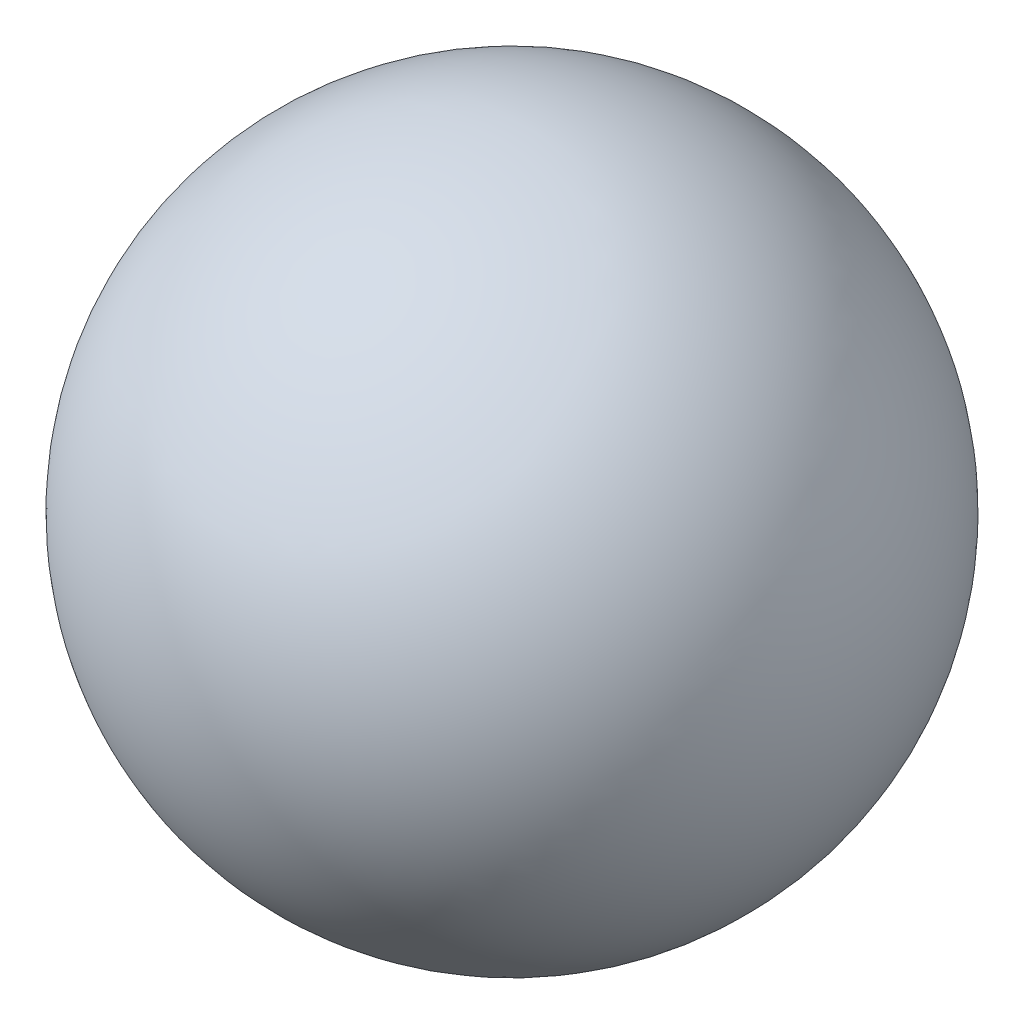
ISO-10303-21;
HEADER;
FILE_DESCRIPTION(('STEP AP214'),'2;1');
FILE_NAME('part.step','',(''),(''),'','','');
FILE_SCHEMA(('AUTOMOTIVE_DESIGN { 1 0 10303 214 1 1 1 1 }'));
ENDSEC;
DATA;
#1=APPLICATION_CONTEXT('core data for automotive mechanical design processes');
#2=APPLICATION_PROTOCOL_DEFINITION('international standard','automotive_design',2000,#1);
#3=PRODUCT_CONTEXT('',#1,'mechanical');
#4=PRODUCT('Part','Part','',(#3));
#5=PRODUCT_RELATED_PRODUCT_CATEGORY('part','',(#4));
#6=PRODUCT_DEFINITION_FORMATION('','',#4);
#7=PRODUCT_DEFINITION_CONTEXT('part definition',#1,'design');
#8=PRODUCT_DEFINITION('design','',#6,#7);
#9=PRODUCT_DEFINITION_SHAPE('','',#8);
#10=(LENGTH_UNIT() NAMED_UNIT(*) SI_UNIT(.MILLI.,.METRE.));
#11=(NAMED_UNIT(*) PLANE_ANGLE_UNIT() SI_UNIT($,.RADIAN.));
#12=(NAMED_UNIT(*) SI_UNIT($,.STERADIAN.) SOLID_ANGLE_UNIT());
#13=UNCERTAINTY_MEASURE_WITH_UNIT(LENGTH_MEASURE(1.E-05),#10,'distance_accuracy_value','');
#14=(GEOMETRIC_REPRESENTATION_CONTEXT(3) GLOBAL_UNCERTAINTY_ASSIGNED_CONTEXT((#13)) GLOBAL_UNIT_ASSIGNED_CONTEXT((#10,
#11,#12)) REPRESENTATION_CONTEXT('',''));
#15=CARTESIAN_POINT('',(0.,0.,0.));
#16=DIRECTION('',(0.,0.,1.));
#17=DIRECTION('',(1.,0.,0.));
#18=AXIS2_PLACEMENT_3D('',#15,#16,#17);
#19=CARTESIAN_POINT('',(0.,0.,0.));
#20=DIRECTION('',(0.,0.,-1.));
#21=DIRECTION('',(-1.,0.,0.));
#22=AXIS2_PLACEMENT_3D('',#19,#20,#21);
#23=SPHERICAL_SURFACE('',#22,54.45);
#24=CARTESIAN_POINT('',(0.,0.,-54.45));
#25=VERTEX_POINT('',#24);
#26=VERTEX_LOOP('',#25);
#27=FACE_BOUND('',#26,.T.);
#28=ADVANCED_FACE('F29',(#27),#23,.T.);
#29=CLOSED_SHELL('',(#28));
#30=CARTESIAN_POINT('',(0.,0.,0.));
#31=DIRECTION('',(0.,0.,-1.));
#32=DIRECTION('',(1.,0.,0.));
#33=AXIS2_PLACEMENT_3D('',#30,#31,#32);
#34=SPHERICAL_SURFACE('',#33,44.45);
#35=CARTESIAN_POINT('',(0.,0.,-44.45));
#36=VERTEX_POINT('',#35);
#37=VERTEX_LOOP('',#36);
#38=FACE_BOUND('',#37,.T.);
#39=ADVANCED_FACE('F42',(#38),#34,.F.);
#40=CLOSED_SHELL('',(#39));
#41=ORIENTED_CLOSED_SHELL('',*,#40,.T.);
#42=BREP_WITH_VOIDS('B2',#29,(#41));
#43=ADVANCED_BREP_SHAPE_REPRESENTATION('',(#18,#42),#14);
#44=SHAPE_DEFINITION_REPRESENTATION(#9,#43);
ENDSEC;
END-ISO-10303-21;
